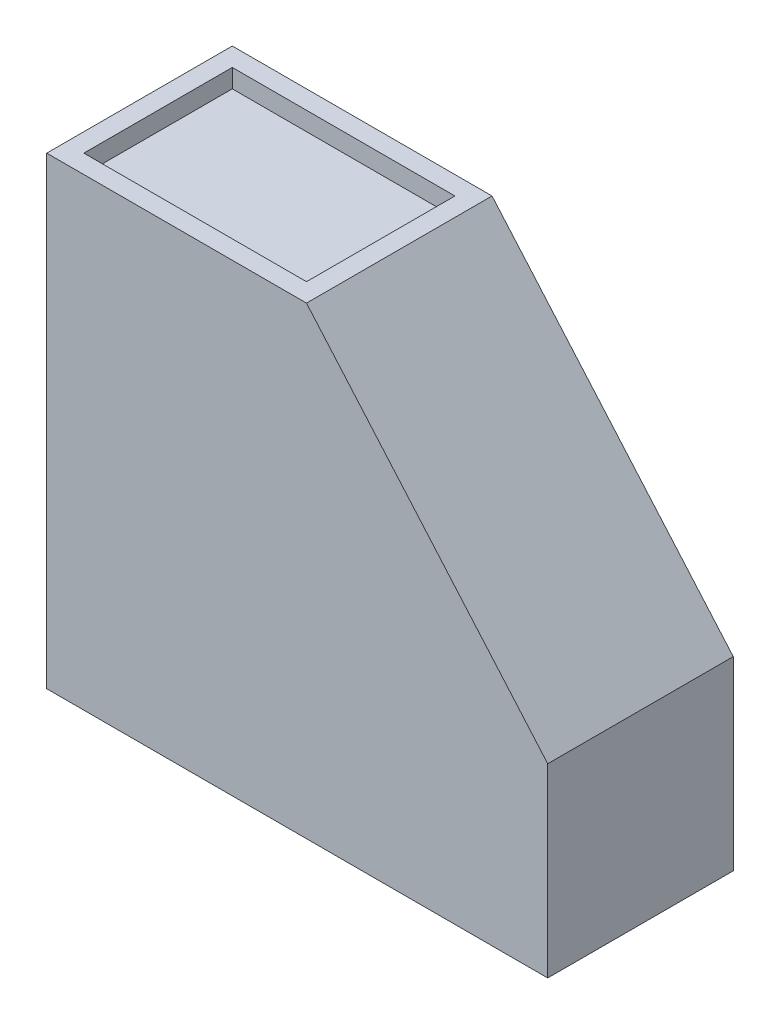
ISO-10303-21;
HEADER;
FILE_DESCRIPTION(('STEP AP214'),'2;1');
FILE_NAME('part.step','',(''),(''),'','','');
FILE_SCHEMA(('AUTOMOTIVE_DESIGN { 1 0 10303 214 1 1 1 1 }'));
ENDSEC;
DATA;
#1=APPLICATION_CONTEXT('core data for automotive mechanical design processes');
#2=APPLICATION_PROTOCOL_DEFINITION('international standard','automotive_design',2000,#1);
#3=PRODUCT_CONTEXT('',#1,'mechanical');
#4=PRODUCT('Part','Part','',(#3));
#5=PRODUCT_RELATED_PRODUCT_CATEGORY('part','',(#4));
#6=PRODUCT_DEFINITION_FORMATION('','',#4);
#7=PRODUCT_DEFINITION_CONTEXT('part definition',#1,'design');
#8=PRODUCT_DEFINITION('design','',#6,#7);
#9=PRODUCT_DEFINITION_SHAPE('','',#8);
#10=(LENGTH_UNIT() NAMED_UNIT(*) SI_UNIT(.MILLI.,.METRE.));
#11=(NAMED_UNIT(*) PLANE_ANGLE_UNIT() SI_UNIT($,.RADIAN.));
#12=(NAMED_UNIT(*) SI_UNIT($,.STERADIAN.) SOLID_ANGLE_UNIT());
#13=UNCERTAINTY_MEASURE_WITH_UNIT(LENGTH_MEASURE(1.E-05),#10,'distance_accuracy_value','');
#14=(GEOMETRIC_REPRESENTATION_CONTEXT(3) GLOBAL_UNCERTAINTY_ASSIGNED_CONTEXT((#13)) GLOBAL_UNIT_ASSIGNED_CONTEXT((#10,
#11,#12)) REPRESENTATION_CONTEXT('',''));
#15=CARTESIAN_POINT('',(0.,0.,0.));
#16=DIRECTION('',(0.,0.,1.));
#17=DIRECTION('',(1.,0.,0.));
#18=AXIS2_PLACEMENT_3D('',#15,#16,#17);
#19=CARTESIAN_POINT('',(-135.,-125.,100.));
#20=DIRECTION('',(1.,0.,0.));
#21=DIRECTION('',(0.,0.,-1.));
#22=AXIS2_PLACEMENT_3D('',#19,#20,#21);
#23=PLANE('',#22);
#24=DIRECTION('',(0.,-1.,0.));
#25=VECTOR('',#24,1.);
#26=CARTESIAN_POINT('',(-135.,-125.,0.));
#27=LINE('',#26,#25);
#28=CARTESIAN_POINT('',(-135.,125.,0.));
#29=VERTEX_POINT('',#28);
#30=CARTESIAN_POINT('',(-135.,-125.,0.));
#31=VERTEX_POINT('',#30);
#32=EDGE_CURVE('E120',#29,#31,#27,.T.);
#33=ORIENTED_EDGE('',*,*,#32,.T.);
#34=DIRECTION('',(0.,0.,-1.));
#35=VECTOR('',#34,1.);
#36=CARTESIAN_POINT('',(-135.,-125.,100.));
#37=LINE('',#36,#35);
#38=CARTESIAN_POINT('',(-135.,-125.,100.));
#39=VERTEX_POINT('',#38);
#40=EDGE_CURVE('E11',#39,#31,#37,.T.);
#41=ORIENTED_EDGE('',*,*,#40,.F.);
#42=DIRECTION('',(0.,-1.,0.));
#43=VECTOR('',#42,1.);
#44=CARTESIAN_POINT('',(-135.,-125.,100.));
#45=LINE('',#44,#43);
#46=CARTESIAN_POINT('',(-135.,125.,100.));
#47=VERTEX_POINT('',#46);
#48=EDGE_CURVE('E130',#47,#39,#45,.T.);
#49=ORIENTED_EDGE('',*,*,#48,.F.);
#50=DIRECTION('',(0.,0.,-1.));
#51=VECTOR('',#50,1.);
#52=CARTESIAN_POINT('',(-135.,125.,100.));
#53=LINE('',#52,#51);
#54=EDGE_CURVE('E116',#47,#29,#53,.T.);
#55=ORIENTED_EDGE('',*,*,#54,.T.);
#56=EDGE_LOOP('',(#33,#41,#49,#55));
#57=FACE_BOUND('',#56,.T.);
#58=ADVANCED_FACE('F34',(#57),#23,.F.);
#59=CARTESIAN_POINT('',(-135.,-125.,100.));
#60=DIRECTION('',(0.,1.,0.));
#61=DIRECTION('',(0.,0.,1.));
#62=AXIS2_PLACEMENT_3D('',#59,#60,#61);
#63=PLANE('',#62);
#64=DIRECTION('',(1.,0.,0.));
#65=VECTOR('',#64,1.);
#66=CARTESIAN_POINT('',(-135.,-125.,0.));
#67=LINE('',#66,#65);
#68=CARTESIAN_POINT('',(135.,-125.,0.));
#69=VERTEX_POINT('',#68);
#70=EDGE_CURVE('E123',#31,#69,#67,.T.);
#71=ORIENTED_EDGE('',*,*,#70,.T.);
#72=DIRECTION('',(0.,0.,-1.));
#73=VECTOR('',#72,1.);
#74=CARTESIAN_POINT('',(135.,-125.,100.));
#75=LINE('',#74,#73);
#76=CARTESIAN_POINT('',(135.,-125.,100.));
#77=VERTEX_POINT('',#76);
#78=EDGE_CURVE('E41',#77,#69,#75,.T.);
#79=ORIENTED_EDGE('',*,*,#78,.F.);
#80=DIRECTION('',(1.,0.,0.));
#81=VECTOR('',#80,1.);
#82=CARTESIAN_POINT('',(-135.,-125.,100.));
#83=LINE('',#82,#81);
#84=EDGE_CURVE('E89',#39,#77,#83,.T.);
#85=ORIENTED_EDGE('',*,*,#84,.F.);
#86=ORIENTED_EDGE('',*,*,#40,.T.);
#87=EDGE_LOOP('',(#71,#79,#85,#86));
#88=FACE_BOUND('',#87,.T.);
#89=ADVANCED_FACE('F211',(#88),#63,.F.);
#90=CARTESIAN_POINT('',(135.,-125.,100.));
#91=DIRECTION('',(-1.,0.,0.));
#92=DIRECTION('',(0.,0.,1.));
#93=AXIS2_PLACEMENT_3D('',#90,#91,#92);
#94=PLANE('',#93);
#95=DIRECTION('',(0.,1.,0.));
#96=VECTOR('',#95,1.);
#97=CARTESIAN_POINT('',(135.,-125.,0.));
#98=LINE('',#97,#96);
#99=CARTESIAN_POINT('',(135.,-25.,0.));
#100=VERTEX_POINT('',#99);
#101=EDGE_CURVE('E109',#69,#100,#98,.T.);
#102=ORIENTED_EDGE('',*,*,#101,.T.);
#103=DIRECTION('',(0.,0.,-1.));
#104=VECTOR('',#103,1.);
#105=CARTESIAN_POINT('',(135.,-25.,100.));
#106=LINE('',#105,#104);
#107=CARTESIAN_POINT('',(135.,-25.,100.));
#108=VERTEX_POINT('',#107);
#109=EDGE_CURVE('E106',#108,#100,#106,.T.);
#110=ORIENTED_EDGE('',*,*,#109,.F.);
#111=DIRECTION('',(0.,1.,0.));
#112=VECTOR('',#111,1.);
#113=CARTESIAN_POINT('',(135.,-125.,100.));
#114=LINE('',#113,#112);
#115=EDGE_CURVE('E96',#77,#108,#114,.T.);
#116=ORIENTED_EDGE('',*,*,#115,.F.);
#117=ORIENTED_EDGE('',*,*,#78,.T.);
#118=EDGE_LOOP('',(#102,#110,#116,#117));
#119=FACE_BOUND('',#118,.T.);
#120=ADVANCED_FACE('F107',(#119),#94,.F.);
#121=CARTESIAN_POINT('',(135.,-25.,100.));
#122=DIRECTION('',(-0.755689082789818,-0.654930538417842,0.));
#123=DIRECTION('',(0.654930538417842,-0.755689082789818,0.));
#124=AXIS2_PLACEMENT_3D('',#121,#122,#123);
#125=PLANE('',#124);
#126=DIRECTION('',(-0.654930538417842,0.755689082789818,0.));
#127=VECTOR('',#126,1.);
#128=CARTESIAN_POINT('',(135.,-25.,0.));
#129=LINE('',#128,#127);
#130=CARTESIAN_POINT('',(5.,125.,0.));
#131=VERTEX_POINT('',#130);
#132=EDGE_CURVE('E127',#100,#131,#129,.T.);
#133=ORIENTED_EDGE('',*,*,#132,.T.);
#134=DIRECTION('',(0.,0.,-1.));
#135=VECTOR('',#134,1.);
#136=CARTESIAN_POINT('',(5.,125.,100.));
#137=LINE('',#136,#135);
#138=CARTESIAN_POINT('',(5.,125.,100.));
#139=VERTEX_POINT('',#138);
#140=EDGE_CURVE('E112',#139,#131,#137,.T.);
#141=ORIENTED_EDGE('',*,*,#140,.F.);
#142=DIRECTION('',(-0.654930538417842,0.755689082789818,0.));
#143=VECTOR('',#142,1.);
#144=CARTESIAN_POINT('',(135.,-25.,100.));
#145=LINE('',#144,#143);
#146=EDGE_CURVE('E100',#108,#139,#145,.T.);
#147=ORIENTED_EDGE('',*,*,#146,.F.);
#148=ORIENTED_EDGE('',*,*,#109,.T.);
#149=EDGE_LOOP('',(#133,#141,#147,#148));
#150=FACE_BOUND('',#149,.T.);
#151=ADVANCED_FACE('F114',(#150),#125,.F.);
#152=CARTESIAN_POINT('',(-135.,125.,100.));
#153=DIRECTION('',(0.,-1.,0.));
#154=DIRECTION('',(0.,0.,-1.));
#155=AXIS2_PLACEMENT_3D('',#152,#153,#154);
#156=PLANE('',#155);
#157=DIRECTION('',(-1.,0.,0.));
#158=VECTOR('',#157,1.);
#159=CARTESIAN_POINT('',(-125.,125.,10.));
#160=LINE('',#159,#158);
#161=CARTESIAN_POINT('',(-5.00000000000053,125.,10.));
#162=VERTEX_POINT('',#161);
#163=CARTESIAN_POINT('',(-125.,125.,10.));
#164=VERTEX_POINT('',#163);
#165=EDGE_CURVE('E158',#162,#164,#160,.T.);
#166=ORIENTED_EDGE('',*,*,#165,.F.);
#167=DIRECTION('',(0.,0.,-1.));
#168=VECTOR('',#167,1.);
#169=CARTESIAN_POINT('',(-5.00000000000052,125.,90.));
#170=LINE('',#169,#168);
#171=CARTESIAN_POINT('',(-5.00000000000052,125.,90.));
#172=VERTEX_POINT('',#171);
#173=EDGE_CURVE('E48',#172,#162,#170,.T.);
#174=ORIENTED_EDGE('',*,*,#173,.F.);
#175=DIRECTION('',(1.,0.,0.));
#176=VECTOR('',#175,1.);
#177=CARTESIAN_POINT('',(-125.,125.,90.));
#178=LINE('',#177,#176);
#179=CARTESIAN_POINT('',(-125.,125.,90.));
#180=VERTEX_POINT('',#179);
#181=EDGE_CURVE('E151',#180,#172,#178,.T.);
#182=ORIENTED_EDGE('',*,*,#181,.F.);
#183=DIRECTION('',(0.,0.,1.));
#184=VECTOR('',#183,1.);
#185=CARTESIAN_POINT('',(-125.,125.,90.));
#186=LINE('',#185,#184);
#187=EDGE_CURVE('E155',#164,#180,#186,.T.);
#188=ORIENTED_EDGE('',*,*,#187,.F.);
#189=EDGE_LOOP('',(#166,#174,#182,#188));
#190=FACE_BOUND('',#189,.T.);
#191=DIRECTION('',(-1.,0.,0.));
#192=VECTOR('',#191,1.);
#193=CARTESIAN_POINT('',(-135.,125.,0.));
#194=LINE('',#193,#192);
#195=EDGE_CURVE('E81',#131,#29,#194,.T.);
#196=ORIENTED_EDGE('',*,*,#195,.T.);
#197=ORIENTED_EDGE('',*,*,#54,.F.);
#198=DIRECTION('',(-1.,0.,0.));
#199=VECTOR('',#198,1.);
#200=CARTESIAN_POINT('',(-135.,125.,100.));
#201=LINE('',#200,#199);
#202=EDGE_CURVE('E57',#139,#47,#201,.T.);
#203=ORIENTED_EDGE('',*,*,#202,.F.);
#204=ORIENTED_EDGE('',*,*,#140,.T.);
#205=EDGE_LOOP('',(#196,#197,#203,#204));
#206=FACE_BOUND('',#205,.T.);
#207=ADVANCED_FACE('F135',(#190,#206),#156,.F.);
#208=CARTESIAN_POINT('',(0.,0.,100.));
#209=DIRECTION('',(0.,0.,-1.));
#210=DIRECTION('',(-1.,0.,0.));
#211=AXIS2_PLACEMENT_3D('',#208,#209,#210);
#212=PLANE('',#211);
#213=ORIENTED_EDGE('',*,*,#48,.T.);
#214=ORIENTED_EDGE('',*,*,#84,.T.);
#215=ORIENTED_EDGE('',*,*,#115,.T.);
#216=ORIENTED_EDGE('',*,*,#146,.T.);
#217=ORIENTED_EDGE('',*,*,#202,.T.);
#218=EDGE_LOOP('',(#213,#214,#215,#216,#217));
#219=FACE_BOUND('',#218,.T.);
#220=ADVANCED_FACE('F98',(#219),#212,.F.);
#221=CARTESIAN_POINT('',(0.,0.,0.));
#222=DIRECTION('',(0.,0.,-1.));
#223=DIRECTION('',(-1.,0.,0.));
#224=AXIS2_PLACEMENT_3D('',#221,#222,#223);
#225=PLANE('',#224);
#226=ORIENTED_EDGE('',*,*,#32,.F.);
#227=ORIENTED_EDGE('',*,*,#195,.F.);
#228=ORIENTED_EDGE('',*,*,#132,.F.);
#229=ORIENTED_EDGE('',*,*,#101,.F.);
#230=ORIENTED_EDGE('',*,*,#70,.F.);
#231=EDGE_LOOP('',(#226,#227,#228,#229,#230));
#232=FACE_BOUND('',#231,.T.);
#233=ADVANCED_FACE('F134',(#232),#225,.T.);
#234=CARTESIAN_POINT('',(-5.00000000000052,115.,90.));
#235=DIRECTION('',(1.,0.,0.));
#236=DIRECTION('',(0.,0.,-1.));
#237=AXIS2_PLACEMENT_3D('',#234,#235,#236);
#238=PLANE('',#237);
#239=ORIENTED_EDGE('',*,*,#173,.T.);
#240=DIRECTION('',(0.,1.,0.));
#241=VECTOR('',#240,1.);
#242=CARTESIAN_POINT('',(-5.00000000000052,115.,10.));
#243=LINE('',#242,#241);
#244=CARTESIAN_POINT('',(-5.00000000000052,115.,10.));
#245=VERTEX_POINT('',#244);
#246=EDGE_CURVE('E141',#245,#162,#243,.T.);
#247=ORIENTED_EDGE('',*,*,#246,.F.);
#248=DIRECTION('',(0.,0.,-1.));
#249=VECTOR('',#248,1.);
#250=CARTESIAN_POINT('',(-5.00000000000052,115.,90.));
#251=LINE('',#250,#249);
#252=CARTESIAN_POINT('',(-5.00000000000052,115.,90.));
#253=VERTEX_POINT('',#252);
#254=EDGE_CURVE('E154',#253,#245,#251,.T.);
#255=ORIENTED_EDGE('',*,*,#254,.F.);
#256=DIRECTION('',(0.,1.,0.));
#257=VECTOR('',#256,1.);
#258=CARTESIAN_POINT('',(-5.00000000000052,115.,90.));
#259=LINE('',#258,#257);
#260=EDGE_CURVE('E124',#253,#172,#259,.T.);
#261=ORIENTED_EDGE('',*,*,#260,.T.);
#262=EDGE_LOOP('',(#239,#247,#255,#261));
#263=FACE_BOUND('',#262,.T.);
#264=ADVANCED_FACE('F179',(#263),#238,.F.);
#265=CARTESIAN_POINT('',(-125.,115.,90.));
#266=DIRECTION('',(0.,0.,1.));
#267=DIRECTION('',(1.,0.,0.));
#268=AXIS2_PLACEMENT_3D('',#265,#266,#267);
#269=PLANE('',#268);
#270=ORIENTED_EDGE('',*,*,#181,.T.);
#271=ORIENTED_EDGE('',*,*,#260,.F.);
#272=DIRECTION('',(1.,0.,0.));
#273=VECTOR('',#272,1.);
#274=CARTESIAN_POINT('',(-125.,115.,90.));
#275=LINE('',#274,#273);
#276=CARTESIAN_POINT('',(-125.,115.,90.));
#277=VERTEX_POINT('',#276);
#278=EDGE_CURVE('E144',#277,#253,#275,.T.);
#279=ORIENTED_EDGE('',*,*,#278,.F.);
#280=DIRECTION('',(0.,1.,0.));
#281=VECTOR('',#280,1.);
#282=CARTESIAN_POINT('',(-125.,115.,90.));
#283=LINE('',#282,#281);
#284=EDGE_CURVE('E147',#277,#180,#283,.T.);
#285=ORIENTED_EDGE('',*,*,#284,.T.);
#286=EDGE_LOOP('',(#270,#271,#279,#285));
#287=FACE_BOUND('',#286,.T.);
#288=ADVANCED_FACE('F190',(#287),#269,.F.);
#289=CARTESIAN_POINT('',(-125.,115.,90.));
#290=DIRECTION('',(-1.,0.,0.));
#291=DIRECTION('',(0.,0.,1.));
#292=AXIS2_PLACEMENT_3D('',#289,#290,#291);
#293=PLANE('',#292);
#294=ORIENTED_EDGE('',*,*,#187,.T.);
#295=ORIENTED_EDGE('',*,*,#284,.F.);
#296=DIRECTION('',(0.,0.,1.));
#297=VECTOR('',#296,1.);
#298=CARTESIAN_POINT('',(-125.,115.,90.));
#299=LINE('',#298,#297);
#300=CARTESIAN_POINT('',(-125.,115.,10.));
#301=VERTEX_POINT('',#300);
#302=EDGE_CURVE('E164',#301,#277,#299,.T.);
#303=ORIENTED_EDGE('',*,*,#302,.F.);
#304=DIRECTION('',(0.,1.,0.));
#305=VECTOR('',#304,1.);
#306=CARTESIAN_POINT('',(-125.,115.,10.));
#307=LINE('',#306,#305);
#308=EDGE_CURVE('E143',#301,#164,#307,.T.);
#309=ORIENTED_EDGE('',*,*,#308,.T.);
#310=EDGE_LOOP('',(#294,#295,#303,#309));
#311=FACE_BOUND('',#310,.T.);
#312=ADVANCED_FACE('F195',(#311),#293,.F.);
#313=CARTESIAN_POINT('',(-125.,115.,10.));
#314=DIRECTION('',(0.,0.,-1.));
#315=DIRECTION('',(-1.,0.,0.));
#316=AXIS2_PLACEMENT_3D('',#313,#314,#315);
#317=PLANE('',#316);
#318=ORIENTED_EDGE('',*,*,#165,.T.);
#319=ORIENTED_EDGE('',*,*,#308,.F.);
#320=DIRECTION('',(-1.,0.,0.));
#321=VECTOR('',#320,1.);
#322=CARTESIAN_POINT('',(-125.,115.,10.));
#323=LINE('',#322,#321);
#324=EDGE_CURVE('E167',#245,#301,#323,.T.);
#325=ORIENTED_EDGE('',*,*,#324,.F.);
#326=ORIENTED_EDGE('',*,*,#246,.T.);
#327=EDGE_LOOP('',(#318,#319,#325,#326));
#328=FACE_BOUND('',#327,.T.);
#329=ADVANCED_FACE('F200',(#328),#317,.F.);
#330=CARTESIAN_POINT('',(0.,115.,0.));
#331=DIRECTION('',(0.,-1.,0.));
#332=DIRECTION('',(0.,0.,-1.));
#333=AXIS2_PLACEMENT_3D('',#330,#331,#332);
#334=PLANE('',#333);
#335=ORIENTED_EDGE('',*,*,#254,.T.);
#336=ORIENTED_EDGE('',*,*,#324,.T.);
#337=ORIENTED_EDGE('',*,*,#302,.T.);
#338=ORIENTED_EDGE('',*,*,#278,.T.);
#339=EDGE_LOOP('',(#335,#336,#337,#338));
#340=FACE_BOUND('',#339,.T.);
#341=ADVANCED_FACE('F174',(#340),#334,.F.);
#342=CLOSED_SHELL('',(#58,#89,#120,#151,#207,#220,#233,#264,#288,#312,#329,#341));
#343=MANIFOLD_SOLID_BREP('B2',#342);
#344=ADVANCED_BREP_SHAPE_REPRESENTATION('',(#18,#343),#14);
#345=SHAPE_DEFINITION_REPRESENTATION(#9,#344);
ENDSEC;
END-ISO-10303-21;
